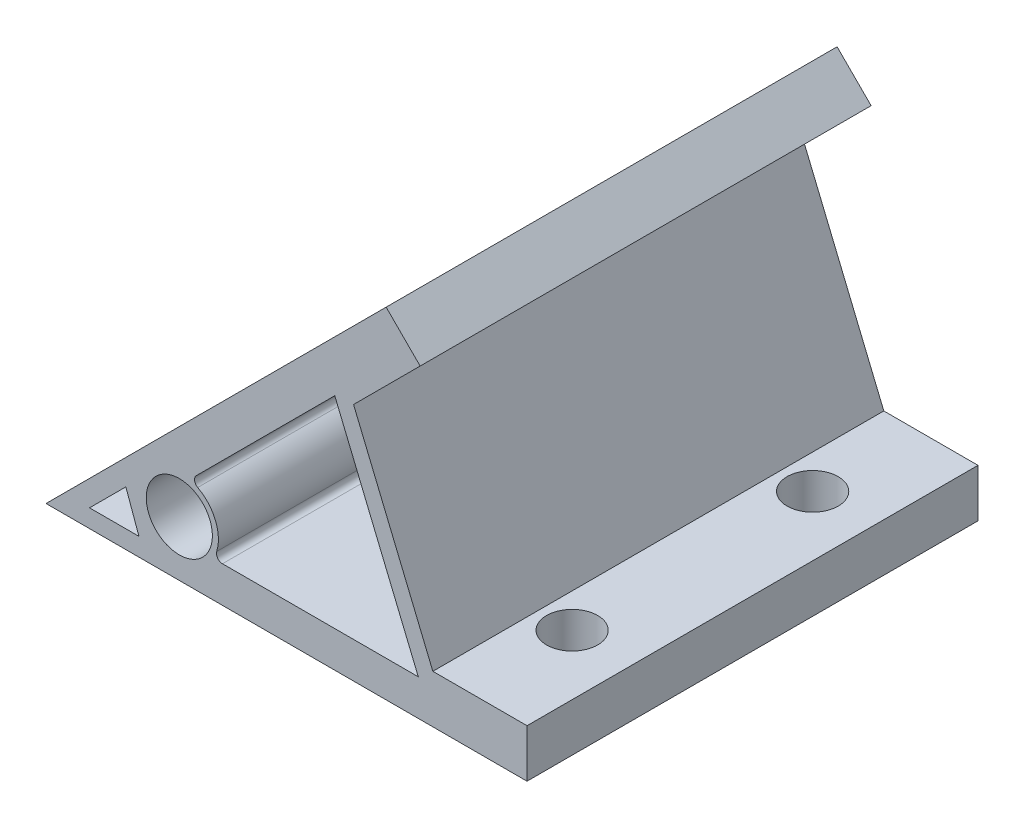
ISO-10303-21;
HEADER;
FILE_DESCRIPTION(('STEP AP214'),'2;1');
FILE_NAME('part.step','',(''),(''),'','','');
FILE_SCHEMA(('AUTOMOTIVE_DESIGN { 1 0 10303 214 1 1 1 1 }'));
ENDSEC;
DATA;
#1=APPLICATION_CONTEXT('core data for automotive mechanical design processes');
#2=APPLICATION_PROTOCOL_DEFINITION('international standard','automotive_design',2000,#1);
#3=PRODUCT_CONTEXT('',#1,'mechanical');
#4=PRODUCT('Part','Part','',(#3));
#5=PRODUCT_RELATED_PRODUCT_CATEGORY('part','',(#4));
#6=PRODUCT_DEFINITION_FORMATION('','',#4);
#7=PRODUCT_DEFINITION_CONTEXT('part definition',#1,'design');
#8=PRODUCT_DEFINITION('design','',#6,#7);
#9=PRODUCT_DEFINITION_SHAPE('','',#8);
#10=(LENGTH_UNIT() NAMED_UNIT(*) SI_UNIT(.MILLI.,.METRE.));
#11=(NAMED_UNIT(*) PLANE_ANGLE_UNIT() SI_UNIT($,.RADIAN.));
#12=(NAMED_UNIT(*) SI_UNIT($,.STERADIAN.) SOLID_ANGLE_UNIT());
#13=UNCERTAINTY_MEASURE_WITH_UNIT(LENGTH_MEASURE(1.E-05),#10,'distance_accuracy_value','');
#14=(GEOMETRIC_REPRESENTATION_CONTEXT(3) GLOBAL_UNCERTAINTY_ASSIGNED_CONTEXT((#13)) GLOBAL_UNIT_ASSIGNED_CONTEXT((#10,
#11,#12)) REPRESENTATION_CONTEXT('',''));
#15=CARTESIAN_POINT('',(0.,0.,0.));
#16=DIRECTION('',(0.,0.,1.));
#17=DIRECTION('',(1.,0.,0.));
#18=AXIS2_PLACEMENT_3D('',#15,#16,#17);
#19=CARTESIAN_POINT('',(0.,0.,37.5));
#20=DIRECTION('',(0.,0.,-1.));
#21=DIRECTION('',(-1.,0.,0.));
#22=AXIS2_PLACEMENT_3D('',#19,#20,#21);
#23=PLANE('',#22);
#24=CARTESIAN_POINT('',(29.3479527685676,7.00000000000034,37.5));
#25=DIRECTION('',(0.,0.,1.));
#26=DIRECTION('',(1.,0.,0.));
#27=AXIS2_PLACEMENT_3D('',#24,#25,#26);
#28=CIRCLE('',#27,1.00000000000011);
#29=CARTESIAN_POINT('',(28.3913069034612,7.29125365023496,37.5));
#30=VERTEX_POINT('',#29);
#31=CARTESIAN_POINT('',(29.3479527685676,6.00000000000023,37.5));
#32=VERTEX_POINT('',#31);
#33=EDGE_CURVE('E148',#30,#32,#28,.T.);
#34=ORIENTED_EDGE('',*,*,#33,.F.);
#35=CARTESIAN_POINT('',(22.1731087802706,9.18440237676243,37.5));
#36=DIRECTION('',(0.,0.,-1.));
#37=DIRECTION('',(1.,0.,0.));
#38=AXIS2_PLACEMENT_3D('',#35,#36,#37);
#39=CIRCLE('',#38,6.50000000000028);
#40=CARTESIAN_POINT('',(25.2313805376179,14.9199907387542,37.5));
#41=VERTEX_POINT('',#40);
#42=EDGE_CURVE('E179',#41,#30,#39,.T.);
#43=ORIENTED_EDGE('',*,*,#42,.F.);
#44=CARTESIAN_POINT('',(25.7018838849019,15.802388948291,37.5));
#45=DIRECTION('',(0.,0.,1.));
#46=DIRECTION('',(1.,0.,0.));
#47=AXIS2_PLACEMENT_3D('',#44,#45,#46);
#48=CIRCLE('',#47,0.99999999999967);
#49=CARTESIAN_POINT('',(24.9947771037156,16.5094957294774,37.5));
#50=VERTEX_POINT('',#49);
#51=EDGE_CURVE('E177',#50,#41,#48,.T.);
#52=ORIENTED_EDGE('',*,*,#51,.F.);
#53=DIRECTION('',(-0.707106781186548,-0.707106781186548,0.));
#54=VECTOR('',#53,1.);
#55=CARTESIAN_POINT('',(24.9947771037156,16.5094957294774,37.5));
#56=LINE('',#55,#54);
#57=CARTESIAN_POINT('',(48.0241796055569,39.5388982313187,37.5));
#58=VERTEX_POINT('',#57);
#59=EDGE_CURVE('E172',#58,#50,#56,.T.);
#60=ORIENTED_EDGE('',*,*,#59,.F.);
#61=DIRECTION('',(-0.382683432365091,0.923879532511286,0.));
#62=VECTOR('',#61,1.);
#63=CARTESIAN_POINT('',(61.9164461200201,6.00000000000023,37.5));
#64=LINE('',#63,#62);
#65=CARTESIAN_POINT('',(61.9164461200201,6.00000000000023,37.5));
#66=VERTEX_POINT('',#65);
#67=EDGE_CURVE('E170',#66,#58,#64,.T.);
#68=ORIENTED_EDGE('',*,*,#67,.F.);
#69=DIRECTION('',(1.,0.,0.));
#70=VECTOR('',#69,1.);
#71=CARTESIAN_POINT('',(29.3479527685676,6.00000000000023,37.5));
#72=LINE('',#71,#70);
#73=EDGE_CURVE('E156',#32,#66,#72,.T.);
#74=ORIENTED_EDGE('',*,*,#73,.F.);
#75=EDGE_LOOP('',(#34,#43,#52,#60,#68,#74));
#76=FACE_BOUND('',#75,.T.);
#77=DIRECTION('',(-0.707106781186548,-0.707106781186548,0.));
#78=VECTOR('',#77,1.);
#79=CARTESIAN_POINT('',(0.,0.,37.5));
#80=LINE('',#79,#78);
#81=CARTESIAN_POINT('',(56.5685424949236,56.5685424949236,37.5));
#82=VERTEX_POINT('',#81);
#83=CARTESIAN_POINT('',(0.,0.,37.5));
#84=VERTEX_POINT('',#83);
#85=EDGE_CURVE('E226',#82,#84,#80,.T.);
#86=ORIENTED_EDGE('',*,*,#85,.T.);
#87=DIRECTION('',(1.,0.,0.));
#88=VECTOR('',#87,1.);
#89=CARTESIAN_POINT('',(0.,0.,37.5));
#90=LINE('',#89,#88);
#91=CARTESIAN_POINT('',(80.0000000000001,0.,37.5));
#92=VERTEX_POINT('',#91);
#93=EDGE_CURVE('E229',#84,#92,#90,.T.);
#94=ORIENTED_EDGE('',*,*,#93,.T.);
#95=DIRECTION('',(0.,1.,0.));
#96=VECTOR('',#95,1.);
#97=CARTESIAN_POINT('',(80.0000000000001,0.,37.5));
#98=LINE('',#97,#96);
#99=CARTESIAN_POINT('',(80.0000000000001,8.00000000000023,37.5));
#100=VERTEX_POINT('',#99);
#101=EDGE_CURVE('E232',#92,#100,#98,.T.);
#102=ORIENTED_EDGE('',*,*,#101,.T.);
#103=DIRECTION('',(-1.,0.,0.));
#104=VECTOR('',#103,1.);
#105=CARTESIAN_POINT('',(64.3351955961515,8.00000000000023,37.5));
#106=LINE('',#105,#104);
#107=CARTESIAN_POINT('',(64.3351955961515,8.00000000000023,37.5));
#108=VERTEX_POINT('',#107);
#109=EDGE_CURVE('E234',#100,#108,#106,.T.);
#110=ORIENTED_EDGE('',*,*,#109,.T.);
#111=DIRECTION('',(-0.382683432365084,0.923879532511289,0.));
#112=VECTOR('',#111,1.);
#113=CARTESIAN_POINT('',(64.3351955961515,8.00000000000023,37.5));
#114=LINE('',#113,#112);
#115=CARTESIAN_POINT('',(51.1487073244941,39.83499882551,37.5));
#116=VERTEX_POINT('',#115);
#117=EDGE_CURVE('E236',#108,#116,#114,.T.);
#118=ORIENTED_EDGE('',*,*,#117,.T.);
#119=DIRECTION('',(0.707106781186547,0.707106781186547,0.));
#120=VECTOR('',#119,1.);
#121=CARTESIAN_POINT('',(51.1487073244941,39.83499882551,37.5));
#122=LINE('',#121,#120);
#123=CARTESIAN_POINT('',(62.2253967444156,50.9116882454316,37.5));
#124=VERTEX_POINT('',#123);
#125=EDGE_CURVE('E238',#116,#124,#122,.T.);
#126=ORIENTED_EDGE('',*,*,#125,.T.);
#127=DIRECTION('',(-0.707106781186548,0.707106781186548,0.));
#128=VECTOR('',#127,1.);
#129=CARTESIAN_POINT('',(56.5685424949236,56.5685424949236,37.5));
#130=LINE('',#129,#128);
#131=EDGE_CURVE('E240',#124,#82,#130,.T.);
#132=ORIENTED_EDGE('',*,*,#131,.T.);
#133=EDGE_LOOP('',(#86,#94,#102,#110,#118,#126,#132));
#134=FACE_BOUND('',#133,.T.);
#135=DIRECTION('',(-0.707106781186547,-0.707106781186547,0.));
#136=VECTOR('',#135,1.);
#137=CARTESIAN_POINT('',(7.24264068711911,3.00000000000011,37.5));
#138=LINE('',#137,#136);
#139=CARTESIAN_POINT('',(13.2794149525577,9.0367742654387,37.5));
#140=VERTEX_POINT('',#139);
#141=CARTESIAN_POINT('',(7.24264068711911,3.00000000000011,37.5));
#142=VERTEX_POINT('',#141);
#143=EDGE_CURVE('E202',#140,#142,#138,.T.);
#144=ORIENTED_EDGE('',*,*,#143,.F.);
#145=DIRECTION('',(-0.33933453614335,0.940665760289157,0.));
#146=VECTOR('',#145,1.);
#147=CARTESIAN_POINT('',(15.4571130060459,3.00000000000011,37.5));
#148=LINE('',#147,#146);
#149=CARTESIAN_POINT('',(15.4571130060459,3.00000000000011,37.5));
#150=VERTEX_POINT('',#149);
#151=EDGE_CURVE('E208',#150,#140,#148,.T.);
#152=ORIENTED_EDGE('',*,*,#151,.F.);
#153=DIRECTION('',(1.,0.,0.));
#154=VECTOR('',#153,1.);
#155=CARTESIAN_POINT('',(7.24264068711911,3.00000000000011,37.5));
#156=LINE('',#155,#154);
#157=EDGE_CURVE('E204',#142,#150,#156,.T.);
#158=ORIENTED_EDGE('',*,*,#157,.F.);
#159=EDGE_LOOP('',(#144,#152,#158));
#160=FACE_BOUND('',#159,.T.);
#161=CARTESIAN_POINT('',(22.1731087802706,9.18440237676243,37.5));
#162=DIRECTION('',(0.,0.,1.));
#163=DIRECTION('',(1.,0.,0.));
#164=AXIS2_PLACEMENT_3D('',#161,#162,#163);
#165=CIRCLE('',#164,5.50000000000008);
#166=CARTESIAN_POINT('',(27.6731087802706,9.18440237676243,37.5));
#167=VERTEX_POINT('',#166);
#168=EDGE_CURVE('E182',#167,#167,#165,.T.);
#169=ORIENTED_EDGE('',*,*,#168,.F.);
#170=EDGE_LOOP('',(#169));
#171=FACE_BOUND('',#170,.T.);
#172=ADVANCED_FACE('F33',(#76,#134,#160,#171),#23,.F.);
#173=CARTESIAN_POINT('',(0.,0.,-37.5));
#174=DIRECTION('',(0.,0.,-1.));
#175=DIRECTION('',(-1.,0.,0.));
#176=AXIS2_PLACEMENT_3D('',#173,#174,#175);
#177=PLANE('',#176);
#178=CARTESIAN_POINT('',(22.1731087802706,9.18440237676243,-37.5));
#179=DIRECTION('',(0.,0.,-1.));
#180=DIRECTION('',(1.,0.,0.));
#181=AXIS2_PLACEMENT_3D('',#178,#179,#180);
#182=CIRCLE('',#181,6.50000000000028);
#183=CARTESIAN_POINT('',(25.2313805376179,14.9199907387541,-37.5));
#184=VERTEX_POINT('',#183);
#185=CARTESIAN_POINT('',(28.3913069034612,7.29125365023496,-37.5));
#186=VERTEX_POINT('',#185);
#187=EDGE_CURVE('E157',#184,#186,#182,.T.);
#188=ORIENTED_EDGE('',*,*,#187,.T.);
#189=CARTESIAN_POINT('',(29.3479527685676,7.00000000000034,-37.5));
#190=DIRECTION('',(0.,0.,1.));
#191=DIRECTION('',(1.,0.,0.));
#192=AXIS2_PLACEMENT_3D('',#189,#190,#191);
#193=CIRCLE('',#192,1.00000000000011);
#194=CARTESIAN_POINT('',(29.3479527685676,6.00000000000023,-37.5));
#195=VERTEX_POINT('',#194);
#196=EDGE_CURVE('E58',#186,#195,#193,.T.);
#197=ORIENTED_EDGE('',*,*,#196,.T.);
#198=DIRECTION('',(1.,0.,0.));
#199=VECTOR('',#198,1.);
#200=CARTESIAN_POINT('',(29.3479527685676,6.00000000000023,-37.5));
#201=LINE('',#200,#199);
#202=CARTESIAN_POINT('',(61.9164461200201,6.00000000000023,-37.5));
#203=VERTEX_POINT('',#202);
#204=EDGE_CURVE('E163',#195,#203,#201,.T.);
#205=ORIENTED_EDGE('',*,*,#204,.T.);
#206=DIRECTION('',(-0.382683432365091,0.923879532511286,0.));
#207=VECTOR('',#206,1.);
#208=CARTESIAN_POINT('',(61.9164461200201,6.00000000000023,-37.5));
#209=LINE('',#208,#207);
#210=CARTESIAN_POINT('',(48.0241796055569,39.5388982313187,-37.5));
#211=VERTEX_POINT('',#210);
#212=EDGE_CURVE('E184',#203,#211,#209,.T.);
#213=ORIENTED_EDGE('',*,*,#212,.T.);
#214=DIRECTION('',(-0.707106781186548,-0.707106781186548,0.));
#215=VECTOR('',#214,1.);
#216=CARTESIAN_POINT('',(24.9947771037156,16.5094957294774,-37.5));
#217=LINE('',#216,#215);
#218=CARTESIAN_POINT('',(24.9947771037156,16.5094957294774,-37.5));
#219=VERTEX_POINT('',#218);
#220=EDGE_CURVE('E187',#211,#219,#217,.T.);
#221=ORIENTED_EDGE('',*,*,#220,.T.);
#222=CARTESIAN_POINT('',(25.7018838849019,15.802388948291,-37.5));
#223=DIRECTION('',(0.,0.,1.));
#224=DIRECTION('',(1.,0.,0.));
#225=AXIS2_PLACEMENT_3D('',#222,#223,#224);
#226=CIRCLE('',#225,0.99999999999967);
#227=EDGE_CURVE('E190',#219,#184,#226,.T.);
#228=ORIENTED_EDGE('',*,*,#227,.T.);
#229=EDGE_LOOP('',(#188,#197,#205,#213,#221,#228));
#230=FACE_BOUND('',#229,.T.);
#231=DIRECTION('',(-0.707106781186548,-0.707106781186548,0.));
#232=VECTOR('',#231,1.);
#233=CARTESIAN_POINT('',(0.,0.,-37.5));
#234=LINE('',#233,#232);
#235=CARTESIAN_POINT('',(56.5685424949236,56.5685424949236,-37.5));
#236=VERTEX_POINT('',#235);
#237=CARTESIAN_POINT('',(0.,0.,-37.5));
#238=VERTEX_POINT('',#237);
#239=EDGE_CURVE('E225',#236,#238,#234,.T.);
#240=ORIENTED_EDGE('',*,*,#239,.F.);
#241=DIRECTION('',(-0.707106781186548,0.707106781186548,0.));
#242=VECTOR('',#241,1.);
#243=CARTESIAN_POINT('',(56.5685424949236,56.5685424949236,-37.5));
#244=LINE('',#243,#242);
#245=CARTESIAN_POINT('',(62.2253967444156,50.9116882454316,-37.5));
#246=VERTEX_POINT('',#245);
#247=EDGE_CURVE('E230',#246,#236,#244,.T.);
#248=ORIENTED_EDGE('',*,*,#247,.F.);
#249=DIRECTION('',(0.707106781186547,0.707106781186547,0.));
#250=VECTOR('',#249,1.);
#251=CARTESIAN_POINT('',(51.1487073244941,39.83499882551,-37.5));
#252=LINE('',#251,#250);
#253=CARTESIAN_POINT('',(51.1487073244941,39.83499882551,-37.5));
#254=VERTEX_POINT('',#253);
#255=EDGE_CURVE('E253',#254,#246,#252,.T.);
#256=ORIENTED_EDGE('',*,*,#255,.F.);
#257=DIRECTION('',(-0.382683432365084,0.923879532511289,0.));
#258=VECTOR('',#257,1.);
#259=CARTESIAN_POINT('',(64.3351955961515,8.00000000000023,-37.5));
#260=LINE('',#259,#258);
#261=CARTESIAN_POINT('',(64.3351955961515,8.00000000000023,-37.5));
#262=VERTEX_POINT('',#261);
#263=EDGE_CURVE('E251',#262,#254,#260,.T.);
#264=ORIENTED_EDGE('',*,*,#263,.F.);
#265=DIRECTION('',(-1.,0.,0.));
#266=VECTOR('',#265,1.);
#267=CARTESIAN_POINT('',(64.3351955961515,8.00000000000023,-37.5));
#268=LINE('',#267,#266);
#269=CARTESIAN_POINT('',(80.0000000000001,8.00000000000023,-37.5));
#270=VERTEX_POINT('',#269);
#271=EDGE_CURVE('E249',#270,#262,#268,.T.);
#272=ORIENTED_EDGE('',*,*,#271,.F.);
#273=DIRECTION('',(0.,1.,0.));
#274=VECTOR('',#273,1.);
#275=CARTESIAN_POINT('',(80.0000000000001,0.,-37.5));
#276=LINE('',#275,#274);
#277=CARTESIAN_POINT('',(80.0000000000001,0.,-37.5));
#278=VERTEX_POINT('',#277);
#279=EDGE_CURVE('E247',#278,#270,#276,.T.);
#280=ORIENTED_EDGE('',*,*,#279,.F.);
#281=DIRECTION('',(1.,0.,0.));
#282=VECTOR('',#281,1.);
#283=CARTESIAN_POINT('',(0.,0.,-37.5));
#284=LINE('',#283,#282);
#285=EDGE_CURVE('E245',#238,#278,#284,.T.);
#286=ORIENTED_EDGE('',*,*,#285,.F.);
#287=EDGE_LOOP('',(#240,#248,#256,#264,#272,#280,#286));
#288=FACE_BOUND('',#287,.T.);
#289=DIRECTION('',(-0.33933453614335,0.940665760289157,0.));
#290=VECTOR('',#289,1.);
#291=CARTESIAN_POINT('',(15.4571130060459,3.00000000000011,-37.5));
#292=LINE('',#291,#290);
#293=CARTESIAN_POINT('',(15.4571130060459,3.00000000000011,-37.5));
#294=VERTEX_POINT('',#293);
#295=CARTESIAN_POINT('',(13.2794149525577,9.0367742654387,-37.5));
#296=VERTEX_POINT('',#295);
#297=EDGE_CURVE('E205',#294,#296,#292,.T.);
#298=ORIENTED_EDGE('',*,*,#297,.T.);
#299=DIRECTION('',(-0.707106781186547,-0.707106781186547,0.));
#300=VECTOR('',#299,1.);
#301=CARTESIAN_POINT('',(7.24264068711911,3.00000000000011,-37.5));
#302=LINE('',#301,#300);
#303=CARTESIAN_POINT('',(7.24264068711911,3.00000000000011,-37.5));
#304=VERTEX_POINT('',#303);
#305=EDGE_CURVE('E164',#296,#304,#302,.T.);
#306=ORIENTED_EDGE('',*,*,#305,.T.);
#307=DIRECTION('',(1.,0.,0.));
#308=VECTOR('',#307,1.);
#309=CARTESIAN_POINT('',(7.24264068711911,3.00000000000011,-37.5));
#310=LINE('',#309,#308);
#311=EDGE_CURVE('E213',#304,#294,#310,.T.);
#312=ORIENTED_EDGE('',*,*,#311,.T.);
#313=EDGE_LOOP('',(#298,#306,#312));
#314=FACE_BOUND('',#313,.T.);
#315=CARTESIAN_POINT('',(22.1731087802706,9.18440237676243,-37.5));
#316=DIRECTION('',(0.,0.,1.));
#317=DIRECTION('',(1.,0.,0.));
#318=AXIS2_PLACEMENT_3D('',#315,#316,#317);
#319=CIRCLE('',#318,5.50000000000008);
#320=CARTESIAN_POINT('',(27.6731087802706,9.18440237676243,-37.5));
#321=VERTEX_POINT('',#320);
#322=EDGE_CURVE('E273',#321,#321,#319,.T.);
#323=ORIENTED_EDGE('',*,*,#322,.T.);
#324=EDGE_LOOP('',(#323));
#325=FACE_BOUND('',#324,.T.);
#326=ADVANCED_FACE('F294',(#230,#288,#314,#325),#177,.T.);
#327=CARTESIAN_POINT('',(0.,0.,37.5));
#328=DIRECTION('',(0.707106781186548,-0.707106781186548,0.));
#329=DIRECTION('',(0.707106781186548,0.707106781186548,0.));
#330=AXIS2_PLACEMENT_3D('',#327,#328,#329);
#331=PLANE('',#330);
#332=CARTESIAN_POINT('',(49.4974746830581,49.4974746830581,-20.));
#333=DIRECTION('',(-0.707106781186548,0.707106781186547,0.));
#334=DIRECTION('',(-0.707106781186547,-0.707106781186548,0.));
#335=AXIS2_PLACEMENT_3D('',#332,#333,#334);
#336=CIRCLE('',#335,4.25);
#337=CARTESIAN_POINT('',(46.4922708630153,46.4922708630153,-20.));
#338=VERTEX_POINT('',#337);
#339=EDGE_CURVE('E283',#338,#338,#336,.T.);
#340=ORIENTED_EDGE('',*,*,#339,.F.);
#341=EDGE_LOOP('',(#340));
#342=FACE_BOUND('',#341,.T.);
#343=CARTESIAN_POINT('',(49.4974746830581,49.4974746830581,20.));
#344=DIRECTION('',(-0.707106781186548,0.707106781186547,0.));
#345=DIRECTION('',(-0.707106781186547,-0.707106781186548,0.));
#346=AXIS2_PLACEMENT_3D('',#343,#344,#345);
#347=CIRCLE('',#346,4.25);
#348=CARTESIAN_POINT('',(46.4922708630153,46.4922708630153,20.));
#349=VERTEX_POINT('',#348);
#350=EDGE_CURVE('E274',#349,#349,#347,.T.);
#351=ORIENTED_EDGE('',*,*,#350,.F.);
#352=EDGE_LOOP('',(#351));
#353=FACE_BOUND('',#352,.T.);
#354=ORIENTED_EDGE('',*,*,#239,.T.);
#355=DIRECTION('',(0.,0.,-1.));
#356=VECTOR('',#355,1.);
#357=CARTESIAN_POINT('',(0.,0.,37.5));
#358=LINE('',#357,#356);
#359=EDGE_CURVE('E11',#84,#238,#358,.T.);
#360=ORIENTED_EDGE('',*,*,#359,.F.);
#361=ORIENTED_EDGE('',*,*,#85,.F.);
#362=DIRECTION('',(0.,0.,-1.));
#363=VECTOR('',#362,1.);
#364=CARTESIAN_POINT('',(56.5685424949236,56.5685424949236,37.5));
#365=LINE('',#364,#363);
#366=EDGE_CURVE('E242',#82,#236,#365,.T.);
#367=ORIENTED_EDGE('',*,*,#366,.T.);
#368=EDGE_LOOP('',(#354,#360,#361,#367));
#369=FACE_BOUND('',#368,.T.);
#370=ADVANCED_FACE('F35',(#342,#353,#369),#331,.F.);
#371=CARTESIAN_POINT('',(0.,0.,37.5));
#372=DIRECTION('',(0.,1.,0.));
#373=DIRECTION('',(0.,0.,1.));
#374=AXIS2_PLACEMENT_3D('',#371,#372,#373);
#375=PLANE('',#374);
#376=CARTESIAN_POINT('',(70.0000000000001,0.,-20.));
#377=DIRECTION('',(0.,1.,0.));
#378=DIRECTION('',(0.,0.,1.));
#379=AXIS2_PLACEMENT_3D('',#376,#377,#378);
#380=CIRCLE('',#379,4.25);
#381=CARTESIAN_POINT('',(70.0000000000001,0.,-15.75));
#382=VERTEX_POINT('',#381);
#383=EDGE_CURVE('E334',#382,#382,#380,.T.);
#384=ORIENTED_EDGE('',*,*,#383,.T.);
#385=EDGE_LOOP('',(#384));
#386=FACE_BOUND('',#385,.T.);
#387=CARTESIAN_POINT('',(70.0000000000001,0.,20.));
#388=DIRECTION('',(0.,1.,0.));
#389=DIRECTION('',(0.,0.,1.));
#390=AXIS2_PLACEMENT_3D('',#387,#388,#389);
#391=CIRCLE('',#390,4.25);
#392=CARTESIAN_POINT('',(70.0000000000001,0.,24.25));
#393=VERTEX_POINT('',#392);
#394=EDGE_CURVE('E338',#393,#393,#391,.T.);
#395=ORIENTED_EDGE('',*,*,#394,.T.);
#396=EDGE_LOOP('',(#395));
#397=FACE_BOUND('',#396,.T.);
#398=ORIENTED_EDGE('',*,*,#285,.T.);
#399=DIRECTION('',(0.,0.,-1.));
#400=VECTOR('',#399,1.);
#401=CARTESIAN_POINT('',(80.0000000000001,0.,37.5));
#402=LINE('',#401,#400);
#403=EDGE_CURVE('E42',#92,#278,#402,.T.);
#404=ORIENTED_EDGE('',*,*,#403,.F.);
#405=ORIENTED_EDGE('',*,*,#93,.F.);
#406=ORIENTED_EDGE('',*,*,#359,.T.);
#407=EDGE_LOOP('',(#398,#404,#405,#406));
#408=FACE_BOUND('',#407,.T.);
#409=ADVANCED_FACE('F323',(#386,#397,#408),#375,.F.);
#410=CARTESIAN_POINT('',(80.0000000000001,0.,37.5));
#411=DIRECTION('',(-1.,0.,0.));
#412=DIRECTION('',(0.,0.,1.));
#413=AXIS2_PLACEMENT_3D('',#410,#411,#412);
#414=PLANE('',#413);
#415=ORIENTED_EDGE('',*,*,#279,.T.);
#416=DIRECTION('',(0.,0.,-1.));
#417=VECTOR('',#416,1.);
#418=CARTESIAN_POINT('',(80.0000000000001,8.00000000000023,37.5));
#419=LINE('',#418,#417);
#420=EDGE_CURVE('E267',#100,#270,#419,.T.);
#421=ORIENTED_EDGE('',*,*,#420,.F.);
#422=ORIENTED_EDGE('',*,*,#101,.F.);
#423=ORIENTED_EDGE('',*,*,#403,.T.);
#424=EDGE_LOOP('',(#415,#421,#422,#423));
#425=FACE_BOUND('',#424,.T.);
#426=ADVANCED_FACE('F320',(#425),#414,.F.);
#427=CARTESIAN_POINT('',(64.3351955961515,8.00000000000023,37.5));
#428=DIRECTION('',(0.,-1.,0.));
#429=DIRECTION('',(0.,0.,-1.));
#430=AXIS2_PLACEMENT_3D('',#427,#428,#429);
#431=PLANE('',#430);
#432=CARTESIAN_POINT('',(70.0000000000001,8.00000000000023,-20.));
#433=DIRECTION('',(0.,1.,0.));
#434=DIRECTION('',(0.,0.,1.));
#435=AXIS2_PLACEMENT_3D('',#432,#433,#434);
#436=CIRCLE('',#435,4.25);
#437=CARTESIAN_POINT('',(70.0000000000001,8.00000000000023,-15.75));
#438=VERTEX_POINT('',#437);
#439=EDGE_CURVE('E422',#438,#438,#436,.T.);
#440=ORIENTED_EDGE('',*,*,#439,.F.);
#441=EDGE_LOOP('',(#440));
#442=FACE_BOUND('',#441,.T.);
#443=CARTESIAN_POINT('',(70.0000000000001,8.00000000000023,20.));
#444=DIRECTION('',(0.,1.,0.));
#445=DIRECTION('',(0.,0.,1.));
#446=AXIS2_PLACEMENT_3D('',#443,#444,#445);
#447=CIRCLE('',#446,4.25);
#448=CARTESIAN_POINT('',(70.0000000000001,8.00000000000023,24.25));
#449=VERTEX_POINT('',#448);
#450=EDGE_CURVE('E424',#449,#449,#447,.T.);
#451=ORIENTED_EDGE('',*,*,#450,.F.);
#452=EDGE_LOOP('',(#451));
#453=FACE_BOUND('',#452,.T.);
#454=ORIENTED_EDGE('',*,*,#271,.T.);
#455=DIRECTION('',(0.,0.,-1.));
#456=VECTOR('',#455,1.);
#457=CARTESIAN_POINT('',(64.3351955961515,8.00000000000023,37.5));
#458=LINE('',#457,#456);
#459=EDGE_CURVE('E264',#108,#262,#458,.T.);
#460=ORIENTED_EDGE('',*,*,#459,.F.);
#461=ORIENTED_EDGE('',*,*,#109,.F.);
#462=ORIENTED_EDGE('',*,*,#420,.T.);
#463=EDGE_LOOP('',(#454,#460,#461,#462));
#464=FACE_BOUND('',#463,.T.);
#465=ADVANCED_FACE('F316',(#442,#453,#464),#431,.F.);
#466=CARTESIAN_POINT('',(64.3351955961515,8.00000000000023,37.5));
#467=DIRECTION('',(-0.923879532511289,-0.382683432365084,0.));
#468=DIRECTION('',(0.382683432365084,-0.923879532511289,0.));
#469=AXIS2_PLACEMENT_3D('',#466,#467,#468);
#470=PLANE('',#469);
#471=ORIENTED_EDGE('',*,*,#263,.T.);
#472=DIRECTION('',(0.,0.,-1.));
#473=VECTOR('',#472,1.);
#474=CARTESIAN_POINT('',(51.1487073244941,39.83499882551,37.5));
#475=LINE('',#474,#473);
#476=EDGE_CURVE('E261',#116,#254,#475,.T.);
#477=ORIENTED_EDGE('',*,*,#476,.F.);
#478=ORIENTED_EDGE('',*,*,#117,.F.);
#479=ORIENTED_EDGE('',*,*,#459,.T.);
#480=EDGE_LOOP('',(#471,#477,#478,#479));
#481=FACE_BOUND('',#480,.T.);
#482=ADVANCED_FACE('F312',(#481),#470,.F.);
#483=CARTESIAN_POINT('',(51.1487073244941,39.83499882551,37.5));
#484=DIRECTION('',(-0.707106781186548,0.707106781186548,0.));
#485=DIRECTION('',(-0.707106781186548,-0.707106781186548,0.));
#486=AXIS2_PLACEMENT_3D('',#483,#484,#485);
#487=PLANE('',#486);
#488=CARTESIAN_POINT('',(55.1543289325502,43.8406204335661,-20.));
#489=DIRECTION('',(-0.707106781186548,0.707106781186548,0.));
#490=DIRECTION('',(-0.707106781186548,-0.707106781186548,0.));
#491=AXIS2_PLACEMENT_3D('',#488,#489,#490);
#492=CIRCLE('',#491,4.25);
#493=CARTESIAN_POINT('',(52.1491251125073,40.8354166135233,-20.));
#494=VERTEX_POINT('',#493);
#495=EDGE_CURVE('E37',#494,#494,#492,.T.);
#496=ORIENTED_EDGE('',*,*,#495,.T.);
#497=EDGE_LOOP('',(#496));
#498=FACE_BOUND('',#497,.T.);
#499=CARTESIAN_POINT('',(55.1543289325502,43.8406204335661,20.));
#500=DIRECTION('',(-0.707106781186548,0.707106781186548,0.));
#501=DIRECTION('',(-0.707106781186548,-0.707106781186548,0.));
#502=AXIS2_PLACEMENT_3D('',#499,#500,#501);
#503=CIRCLE('',#502,4.25);
#504=CARTESIAN_POINT('',(52.1491251125073,40.8354166135233,20.));
#505=VERTEX_POINT('',#504);
#506=EDGE_CURVE('E271',#505,#505,#503,.T.);
#507=ORIENTED_EDGE('',*,*,#506,.T.);
#508=EDGE_LOOP('',(#507));
#509=FACE_BOUND('',#508,.T.);
#510=ORIENTED_EDGE('',*,*,#255,.T.);
#511=DIRECTION('',(0.,0.,-1.));
#512=VECTOR('',#511,1.);
#513=CARTESIAN_POINT('',(62.2253967444156,50.9116882454316,37.5));
#514=LINE('',#513,#512);
#515=EDGE_CURVE('E258',#124,#246,#514,.T.);
#516=ORIENTED_EDGE('',*,*,#515,.F.);
#517=ORIENTED_EDGE('',*,*,#125,.F.);
#518=ORIENTED_EDGE('',*,*,#476,.T.);
#519=EDGE_LOOP('',(#510,#516,#517,#518));
#520=FACE_BOUND('',#519,.T.);
#521=ADVANCED_FACE('F308',(#498,#509,#520),#487,.F.);
#522=CARTESIAN_POINT('',(56.5685424949236,56.5685424949236,37.5));
#523=DIRECTION('',(-0.707106781186548,-0.707106781186548,0.));
#524=DIRECTION('',(0.707106781186548,-0.707106781186548,0.));
#525=AXIS2_PLACEMENT_3D('',#522,#523,#524);
#526=PLANE('',#525);
#527=ORIENTED_EDGE('',*,*,#247,.T.);
#528=ORIENTED_EDGE('',*,*,#366,.F.);
#529=ORIENTED_EDGE('',*,*,#131,.F.);
#530=ORIENTED_EDGE('',*,*,#515,.T.);
#531=EDGE_LOOP('',(#527,#528,#529,#530));
#532=FACE_BOUND('',#531,.T.);
#533=ADVANCED_FACE('F305',(#532),#526,.F.);
#534=CARTESIAN_POINT('',(7.24264068711911,3.00000000000011,37.5));
#535=DIRECTION('',(0.707106781186548,-0.707106781186548,0.));
#536=DIRECTION('',(0.707106781186548,0.707106781186548,0.));
#537=AXIS2_PLACEMENT_3D('',#534,#535,#536);
#538=PLANE('',#537);
#539=ORIENTED_EDGE('',*,*,#305,.F.);
#540=DIRECTION('',(0.,0.,-1.));
#541=VECTOR('',#540,1.);
#542=CARTESIAN_POINT('',(13.2794149525577,9.0367742654387,37.5));
#543=LINE('',#542,#541);
#544=EDGE_CURVE('E210',#140,#296,#543,.T.);
#545=ORIENTED_EDGE('',*,*,#544,.F.);
#546=ORIENTED_EDGE('',*,*,#143,.T.);
#547=DIRECTION('',(0.,0.,-1.));
#548=VECTOR('',#547,1.);
#549=CARTESIAN_POINT('',(7.24264068711911,3.00000000000011,37.5));
#550=LINE('',#549,#548);
#551=EDGE_CURVE('E222',#142,#304,#550,.T.);
#552=ORIENTED_EDGE('',*,*,#551,.T.);
#553=EDGE_LOOP('',(#539,#545,#546,#552));
#554=FACE_BOUND('',#553,.T.);
#555=ADVANCED_FACE('F302',(#554),#538,.T.);
#556=CARTESIAN_POINT('',(7.24264068711911,3.00000000000011,37.5));
#557=DIRECTION('',(0.,1.,0.));
#558=DIRECTION('',(0.,0.,1.));
#559=AXIS2_PLACEMENT_3D('',#556,#557,#558);
#560=PLANE('',#559);
#561=ORIENTED_EDGE('',*,*,#311,.F.);
#562=ORIENTED_EDGE('',*,*,#551,.F.);
#563=ORIENTED_EDGE('',*,*,#157,.T.);
#564=DIRECTION('',(0.,0.,-1.));
#565=VECTOR('',#564,1.);
#566=CARTESIAN_POINT('',(15.4571130060459,3.00000000000011,37.5));
#567=LINE('',#566,#565);
#568=EDGE_CURVE('E220',#150,#294,#567,.T.);
#569=ORIENTED_EDGE('',*,*,#568,.T.);
#570=EDGE_LOOP('',(#561,#562,#563,#569));
#571=FACE_BOUND('',#570,.T.);
#572=ADVANCED_FACE('F371',(#571),#560,.T.);
#573=CARTESIAN_POINT('',(15.4571130060459,3.00000000000011,37.5));
#574=DIRECTION('',(-0.940665760289157,-0.33933453614335,0.));
#575=DIRECTION('',(0.33933453614335,-0.940665760289157,0.));
#576=AXIS2_PLACEMENT_3D('',#573,#574,#575);
#577=PLANE('',#576);
#578=ORIENTED_EDGE('',*,*,#297,.F.);
#579=ORIENTED_EDGE('',*,*,#568,.F.);
#580=ORIENTED_EDGE('',*,*,#151,.T.);
#581=ORIENTED_EDGE('',*,*,#544,.T.);
#582=EDGE_LOOP('',(#578,#579,#580,#581));
#583=FACE_BOUND('',#582,.T.);
#584=ADVANCED_FACE('F375',(#583),#577,.T.);
#585=CARTESIAN_POINT('',(29.3479527685676,7.00000000000034,37.5));
#586=DIRECTION('',(0.,0.,-1.));
#587=DIRECTION('',(-1.,0.,0.));
#588=AXIS2_PLACEMENT_3D('',#585,#586,#587);
#589=CYLINDRICAL_SURFACE('',#588,1.00000000000011);
#590=ORIENTED_EDGE('',*,*,#196,.F.);
#591=DIRECTION('',(0.,0.,-1.));
#592=VECTOR('',#591,1.);
#593=CARTESIAN_POINT('',(28.3913069034612,7.29125365023496,37.5));
#594=LINE('',#593,#592);
#595=EDGE_CURVE('E152',#30,#186,#594,.T.);
#596=ORIENTED_EDGE('',*,*,#595,.F.);
#597=ORIENTED_EDGE('',*,*,#33,.T.);
#598=DIRECTION('',(0.,0.,-1.));
#599=VECTOR('',#598,1.);
#600=CARTESIAN_POINT('',(29.3479527685676,6.00000000000023,37.5));
#601=LINE('',#600,#599);
#602=EDGE_CURVE('E151',#32,#195,#601,.T.);
#603=ORIENTED_EDGE('',*,*,#602,.T.);
#604=EDGE_LOOP('',(#590,#596,#597,#603));
#605=FACE_BOUND('',#604,.T.);
#606=ADVANCED_FACE('F150',(#605),#589,.F.);
#607=CARTESIAN_POINT('',(29.3479527685676,6.00000000000023,37.5));
#608=DIRECTION('',(0.,1.,0.));
#609=DIRECTION('',(0.,0.,1.));
#610=AXIS2_PLACEMENT_3D('',#607,#608,#609);
#611=PLANE('',#610);
#612=ORIENTED_EDGE('',*,*,#204,.F.);
#613=ORIENTED_EDGE('',*,*,#602,.F.);
#614=ORIENTED_EDGE('',*,*,#73,.T.);
#615=DIRECTION('',(0.,0.,-1.));
#616=VECTOR('',#615,1.);
#617=CARTESIAN_POINT('',(61.9164461200201,6.00000000000023,37.5));
#618=LINE('',#617,#616);
#619=EDGE_CURVE('E165',#66,#203,#618,.T.);
#620=ORIENTED_EDGE('',*,*,#619,.T.);
#621=EDGE_LOOP('',(#612,#613,#614,#620));
#622=FACE_BOUND('',#621,.T.);
#623=ADVANCED_FACE('F160',(#622),#611,.T.);
#624=CARTESIAN_POINT('',(61.9164461200201,6.00000000000023,37.5));
#625=DIRECTION('',(-0.923879532511286,-0.382683432365091,0.));
#626=DIRECTION('',(0.382683432365091,-0.923879532511286,0.));
#627=AXIS2_PLACEMENT_3D('',#624,#625,#626);
#628=PLANE('',#627);
#629=ORIENTED_EDGE('',*,*,#212,.F.);
#630=ORIENTED_EDGE('',*,*,#619,.F.);
#631=ORIENTED_EDGE('',*,*,#67,.T.);
#632=DIRECTION('',(0.,0.,-1.));
#633=VECTOR('',#632,1.);
#634=CARTESIAN_POINT('',(48.0241796055569,39.5388982313187,37.5));
#635=LINE('',#634,#633);
#636=EDGE_CURVE('E199',#58,#211,#635,.T.);
#637=ORIENTED_EDGE('',*,*,#636,.T.);
#638=EDGE_LOOP('',(#629,#630,#631,#637));
#639=FACE_BOUND('',#638,.T.);
#640=ADVANCED_FACE('F386',(#639),#628,.T.);
#641=CARTESIAN_POINT('',(24.9947771037156,16.5094957294774,37.5));
#642=DIRECTION('',(0.707106781186548,-0.707106781186548,0.));
#643=DIRECTION('',(0.707106781186548,0.707106781186548,0.));
#644=AXIS2_PLACEMENT_3D('',#641,#642,#643);
#645=PLANE('',#644);
#646=ORIENTED_EDGE('',*,*,#220,.F.);
#647=ORIENTED_EDGE('',*,*,#636,.F.);
#648=ORIENTED_EDGE('',*,*,#59,.T.);
#649=DIRECTION('',(0.,0.,-1.));
#650=VECTOR('',#649,1.);
#651=CARTESIAN_POINT('',(24.9947771037156,16.5094957294774,37.5));
#652=LINE('',#651,#650);
#653=EDGE_CURVE('E197',#50,#219,#652,.T.);
#654=ORIENTED_EDGE('',*,*,#653,.T.);
#655=EDGE_LOOP('',(#646,#647,#648,#654));
#656=FACE_BOUND('',#655,.T.);
#657=ADVANCED_FACE('F389',(#656),#645,.T.);
#658=CARTESIAN_POINT('',(25.7018838849019,15.802388948291,37.5));
#659=DIRECTION('',(0.,0.,-1.));
#660=DIRECTION('',(-1.,0.,0.));
#661=AXIS2_PLACEMENT_3D('',#658,#659,#660);
#662=CYLINDRICAL_SURFACE('',#661,0.99999999999967);
#663=ORIENTED_EDGE('',*,*,#227,.F.);
#664=ORIENTED_EDGE('',*,*,#653,.F.);
#665=ORIENTED_EDGE('',*,*,#51,.T.);
#666=DIRECTION('',(0.,0.,-1.));
#667=VECTOR('',#666,1.);
#668=CARTESIAN_POINT('',(25.2313805376179,14.9199907387541,37.5));
#669=LINE('',#668,#667);
#670=EDGE_CURVE('E50',#41,#184,#669,.T.);
#671=ORIENTED_EDGE('',*,*,#670,.T.);
#672=EDGE_LOOP('',(#663,#664,#665,#671));
#673=FACE_BOUND('',#672,.T.);
#674=ADVANCED_FACE('F393',(#673),#662,.F.);
#675=CARTESIAN_POINT('',(22.1731087802706,9.18440237676243,37.5));
#676=DIRECTION('',(0.,0.,-1.));
#677=DIRECTION('',(-1.,0.,0.));
#678=AXIS2_PLACEMENT_3D('',#675,#676,#677);
#679=CYLINDRICAL_SURFACE('',#678,6.50000000000028);
#680=ORIENTED_EDGE('',*,*,#187,.F.);
#681=ORIENTED_EDGE('',*,*,#670,.F.);
#682=ORIENTED_EDGE('',*,*,#42,.T.);
#683=ORIENTED_EDGE('',*,*,#595,.T.);
#684=EDGE_LOOP('',(#680,#681,#682,#683));
#685=FACE_BOUND('',#684,.T.);
#686=ADVANCED_FACE('F397',(#685),#679,.T.);
#687=CARTESIAN_POINT('',(22.1731087802706,9.18440237676243,37.5));
#688=DIRECTION('',(0.,0.,-1.));
#689=DIRECTION('',(-1.,0.,0.));
#690=AXIS2_PLACEMENT_3D('',#687,#688,#689);
#691=CYLINDRICAL_SURFACE('',#690,5.50000000000008);
#692=ORIENTED_EDGE('',*,*,#168,.T.);
#693=EDGE_LOOP('',(#692));
#694=FACE_BOUND('',#693,.T.);
#695=ORIENTED_EDGE('',*,*,#322,.F.);
#696=EDGE_LOOP('',(#695));
#697=FACE_BOUND('',#696,.T.);
#698=ADVANCED_FACE('F290',(#694,#697),#691,.F.);
#699=CARTESIAN_POINT('',(58.6898628384832,40.305086527633,20.));
#700=DIRECTION('',(-0.707106781186548,0.707106781186547,0.));
#701=DIRECTION('',(-0.707106781186547,-0.707106781186548,0.));
#702=AXIS2_PLACEMENT_3D('',#699,#700,#701);
#703=CYLINDRICAL_SURFACE('',#702,4.25);
#704=ORIENTED_EDGE('',*,*,#350,.T.);
#705=EDGE_LOOP('',(#704));
#706=FACE_BOUND('',#705,.T.);
#707=ORIENTED_EDGE('',*,*,#506,.F.);
#708=EDGE_LOOP('',(#707));
#709=FACE_BOUND('',#708,.T.);
#710=ADVANCED_FACE('F403',(#706,#709),#703,.F.);
#711=CARTESIAN_POINT('',(58.6898628384832,40.305086527633,-20.));
#712=DIRECTION('',(-0.707106781186548,0.707106781186547,0.));
#713=DIRECTION('',(-0.707106781186547,-0.707106781186548,0.));
#714=AXIS2_PLACEMENT_3D('',#711,#712,#713);
#715=CYLINDRICAL_SURFACE('',#714,4.25);
#716=ORIENTED_EDGE('',*,*,#339,.T.);
#717=EDGE_LOOP('',(#716));
#718=FACE_BOUND('',#717,.T.);
#719=ORIENTED_EDGE('',*,*,#495,.F.);
#720=EDGE_LOOP('',(#719));
#721=FACE_BOUND('',#720,.T.);
#722=ADVANCED_FACE('F406',(#718,#721),#715,.F.);
#723=CARTESIAN_POINT('',(70.0000000000001,0.,20.));
#724=DIRECTION('',(0.,1.,0.));
#725=DIRECTION('',(0.,0.,1.));
#726=AXIS2_PLACEMENT_3D('',#723,#724,#725);
#727=CYLINDRICAL_SURFACE('',#726,4.25);
#728=ORIENTED_EDGE('',*,*,#394,.F.);
#729=EDGE_LOOP('',(#728));
#730=FACE_BOUND('',#729,.T.);
#731=ORIENTED_EDGE('',*,*,#450,.T.);
#732=EDGE_LOOP('',(#731));
#733=FACE_BOUND('',#732,.T.);
#734=ADVANCED_FACE('F409',(#730,#733),#727,.F.);
#735=CARTESIAN_POINT('',(70.0000000000001,0.,-20.));
#736=DIRECTION('',(0.,1.,0.));
#737=DIRECTION('',(0.,0.,1.));
#738=AXIS2_PLACEMENT_3D('',#735,#736,#737);
#739=CYLINDRICAL_SURFACE('',#738,4.25);
#740=ORIENTED_EDGE('',*,*,#383,.F.);
#741=EDGE_LOOP('',(#740));
#742=FACE_BOUND('',#741,.T.);
#743=ORIENTED_EDGE('',*,*,#439,.T.);
#744=EDGE_LOOP('',(#743));
#745=FACE_BOUND('',#744,.T.);
#746=ADVANCED_FACE('F413',(#742,#745),#739,.F.);
#747=CLOSED_SHELL('',(#172,#326,#370,#409,#426,#465,#482,#521,#533,#555,#572,#584,#606,#623,
#640,#657,#674,#686,#698,#710,#722,#734,#746));
#748=MANIFOLD_SOLID_BREP('B2',#747);
#749=ADVANCED_BREP_SHAPE_REPRESENTATION('',(#18,#748),#14);
#750=SHAPE_DEFINITION_REPRESENTATION(#9,#749);
ENDSEC;
END-ISO-10303-21;
